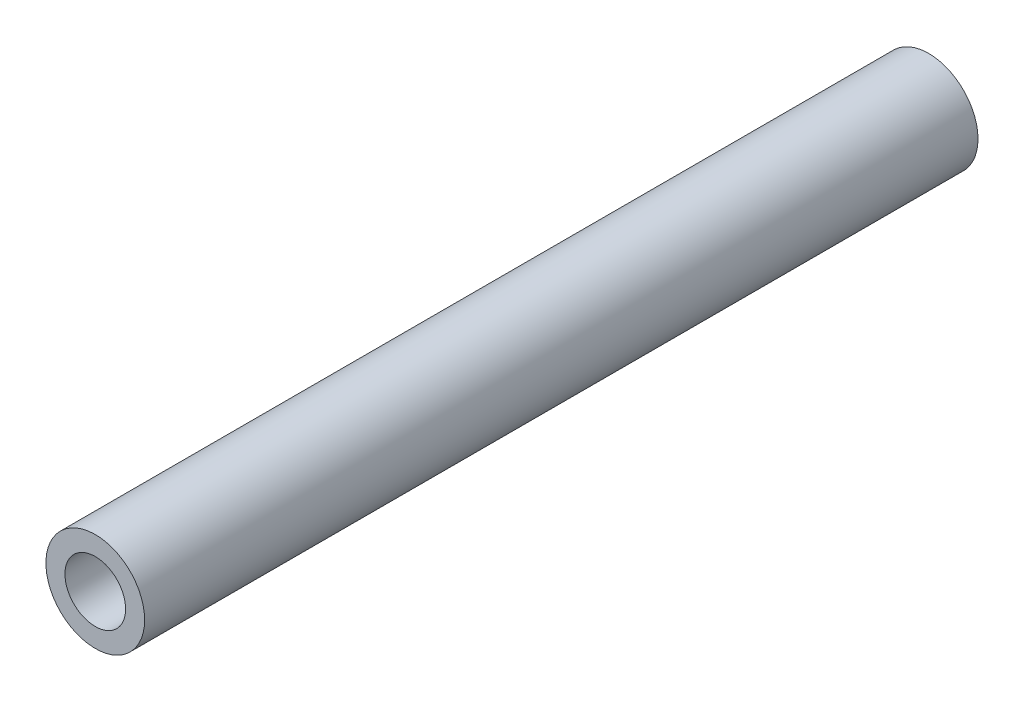
ISO-10303-21;
HEADER;
FILE_DESCRIPTION(('STEP AP214'),'2;1');
FILE_NAME('part.step','',(''),(''),'','','');
FILE_SCHEMA(('AUTOMOTIVE_DESIGN { 1 0 10303 214 1 1 1 1 }'));
ENDSEC;
DATA;
#1=APPLICATION_CONTEXT('core data for automotive mechanical design processes');
#2=APPLICATION_PROTOCOL_DEFINITION('international standard','automotive_design',2000,#1);
#3=PRODUCT_CONTEXT('',#1,'mechanical');
#4=PRODUCT('Part','Part','',(#3));
#5=PRODUCT_RELATED_PRODUCT_CATEGORY('part','',(#4));
#6=PRODUCT_DEFINITION_FORMATION('','',#4);
#7=PRODUCT_DEFINITION_CONTEXT('part definition',#1,'design');
#8=PRODUCT_DEFINITION('design','',#6,#7);
#9=PRODUCT_DEFINITION_SHAPE('','',#8);
#10=(LENGTH_UNIT() NAMED_UNIT(*) SI_UNIT(.MILLI.,.METRE.));
#11=(NAMED_UNIT(*) PLANE_ANGLE_UNIT() SI_UNIT($,.RADIAN.));
#12=(NAMED_UNIT(*) SI_UNIT($,.STERADIAN.) SOLID_ANGLE_UNIT());
#13=UNCERTAINTY_MEASURE_WITH_UNIT(LENGTH_MEASURE(1.E-05),#10,'distance_accuracy_value','');
#14=(GEOMETRIC_REPRESENTATION_CONTEXT(3) GLOBAL_UNCERTAINTY_ASSIGNED_CONTEXT((#13)) GLOBAL_UNIT_ASSIGNED_CONTEXT((#10,
#11,#12)) REPRESENTATION_CONTEXT('',''));
#15=CARTESIAN_POINT('',(0.,0.,0.));
#16=DIRECTION('',(0.,0.,1.));
#17=DIRECTION('',(1.,0.,0.));
#18=AXIS2_PLACEMENT_3D('',#15,#16,#17);
#19=CARTESIAN_POINT('',(0.,0.,33.5026));
#20=DIRECTION('',(0.,0.,1.));
#21=DIRECTION('',(1.,0.,0.));
#22=AXIS2_PLACEMENT_3D('',#19,#20,#21);
#23=PLANE('',#22);
#24=CARTESIAN_POINT('',(0.,0.,33.5026));
#25=DIRECTION('',(0.,0.,1.));
#26=DIRECTION('',(1.,0.,0.));
#27=AXIS2_PLACEMENT_3D('',#24,#25,#26);
#28=CIRCLE('',#27,3.96875);
#29=CARTESIAN_POINT('',(3.96875,0.,33.5026));
#30=VERTEX_POINT('',#29);
#31=EDGE_CURVE('E10',#30,#30,#28,.T.);
#32=ORIENTED_EDGE('',*,*,#31,.T.);
#33=EDGE_LOOP('',(#32));
#34=FACE_BOUND('',#33,.T.);
#35=CARTESIAN_POINT('',(0.,0.,33.5026));
#36=DIRECTION('',(0.,0.,1.));
#37=DIRECTION('',(1.,0.,0.));
#38=AXIS2_PLACEMENT_3D('',#35,#36,#37);
#39=CIRCLE('',#38,2.4384);
#40=CARTESIAN_POINT('',(2.4384,0.,33.5026));
#41=VERTEX_POINT('',#40);
#42=EDGE_CURVE('E44',#41,#41,#39,.T.);
#43=ORIENTED_EDGE('',*,*,#42,.F.);
#44=EDGE_LOOP('',(#43));
#45=FACE_BOUND('',#44,.T.);
#46=ADVANCED_FACE('F33',(#34,#45),#23,.T.);
#47=CARTESIAN_POINT('',(0.,0.,-33.5026));
#48=DIRECTION('',(0.,0.,1.));
#49=DIRECTION('',(1.,0.,0.));
#50=AXIS2_PLACEMENT_3D('',#47,#48,#49);
#51=PLANE('',#50);
#52=CARTESIAN_POINT('',(0.,0.,-33.5026));
#53=DIRECTION('',(0.,0.,1.));
#54=DIRECTION('',(1.,0.,0.));
#55=AXIS2_PLACEMENT_3D('',#52,#53,#54);
#56=CIRCLE('',#55,3.96875);
#57=CARTESIAN_POINT('',(3.96875,0.,-33.5026));
#58=VERTEX_POINT('',#57);
#59=EDGE_CURVE('E37',#58,#58,#56,.T.);
#60=ORIENTED_EDGE('',*,*,#59,.F.);
#61=EDGE_LOOP('',(#60));
#62=FACE_BOUND('',#61,.T.);
#63=CARTESIAN_POINT('',(0.,0.,-33.5026));
#64=DIRECTION('',(0.,0.,1.));
#65=DIRECTION('',(1.,0.,0.));
#66=AXIS2_PLACEMENT_3D('',#63,#64,#65);
#67=CIRCLE('',#66,2.4384);
#68=CARTESIAN_POINT('',(2.4384,0.,-33.5026));
#69=VERTEX_POINT('',#68);
#70=EDGE_CURVE('E46',#69,#69,#67,.T.);
#71=ORIENTED_EDGE('',*,*,#70,.T.);
#72=EDGE_LOOP('',(#71));
#73=FACE_BOUND('',#72,.T.);
#74=ADVANCED_FACE('F56',(#62,#73),#51,.F.);
#75=CARTESIAN_POINT('',(0.,0.,33.5026));
#76=DIRECTION('',(0.,0.,-1.));
#77=DIRECTION('',(-1.,0.,0.));
#78=AXIS2_PLACEMENT_3D('',#75,#76,#77);
#79=CYLINDRICAL_SURFACE('',#78,3.96875);
#80=ORIENTED_EDGE('',*,*,#31,.F.);
#81=EDGE_LOOP('',(#80));
#82=FACE_BOUND('',#81,.T.);
#83=ORIENTED_EDGE('',*,*,#59,.T.);
#84=EDGE_LOOP('',(#83));
#85=FACE_BOUND('',#84,.T.);
#86=ADVANCED_FACE('F35',(#82,#85),#79,.T.);
#87=CARTESIAN_POINT('',(0.,0.,33.5026));
#88=DIRECTION('',(0.,0.,-1.));
#89=DIRECTION('',(-1.,0.,0.));
#90=AXIS2_PLACEMENT_3D('',#87,#88,#89);
#91=CYLINDRICAL_SURFACE('',#90,2.4384);
#92=ORIENTED_EDGE('',*,*,#42,.T.);
#93=EDGE_LOOP('',(#92));
#94=FACE_BOUND('',#93,.T.);
#95=ORIENTED_EDGE('',*,*,#70,.F.);
#96=EDGE_LOOP('',(#95));
#97=FACE_BOUND('',#96,.T.);
#98=ADVANCED_FACE('F52',(#94,#97),#91,.F.);
#99=CLOSED_SHELL('',(#46,#74,#86,#98));
#100=MANIFOLD_SOLID_BREP('B2',#99);
#101=ADVANCED_BREP_SHAPE_REPRESENTATION('',(#18,#100),#14);
#102=SHAPE_DEFINITION_REPRESENTATION(#9,#101);
ENDSEC;
END-ISO-10303-21;
